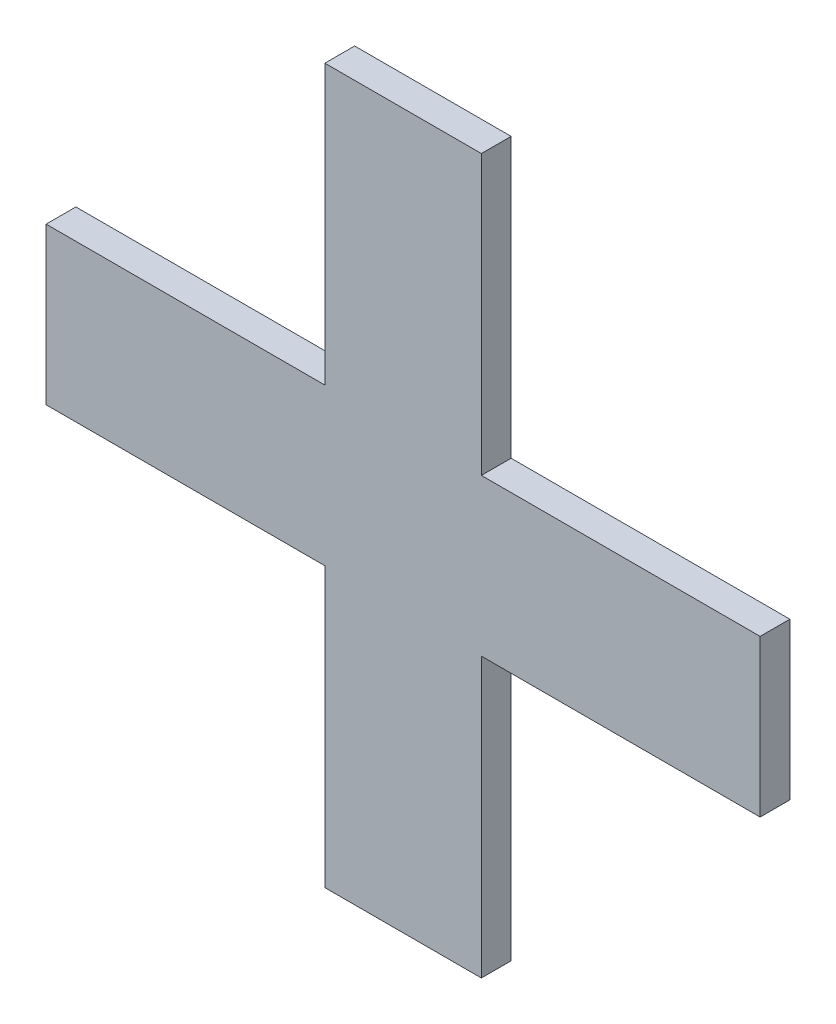
ISO-10303-21;
HEADER;
FILE_DESCRIPTION(('STEP AP214'),'2;1');
FILE_NAME('part.step','',(''),(''),'','','');
FILE_SCHEMA(('AUTOMOTIVE_DESIGN { 1 0 10303 214 1 1 1 1 }'));
ENDSEC;
DATA;
#1=APPLICATION_CONTEXT('core data for automotive mechanical design processes');
#2=APPLICATION_PROTOCOL_DEFINITION('international standard','automotive_design',2000,#1);
#3=PRODUCT_CONTEXT('',#1,'mechanical');
#4=PRODUCT('Part','Part','',(#3));
#5=PRODUCT_RELATED_PRODUCT_CATEGORY('part','',(#4));
#6=PRODUCT_DEFINITION_FORMATION('','',#4);
#7=PRODUCT_DEFINITION_CONTEXT('part definition',#1,'design');
#8=PRODUCT_DEFINITION('design','',#6,#7);
#9=PRODUCT_DEFINITION_SHAPE('','',#8);
#10=(LENGTH_UNIT() NAMED_UNIT(*) SI_UNIT(.MILLI.,.METRE.));
#11=(NAMED_UNIT(*) PLANE_ANGLE_UNIT() SI_UNIT($,.RADIAN.));
#12=(NAMED_UNIT(*) SI_UNIT($,.STERADIAN.) SOLID_ANGLE_UNIT());
#13=UNCERTAINTY_MEASURE_WITH_UNIT(LENGTH_MEASURE(1.E-05),#10,'distance_accuracy_value','');
#14=(GEOMETRIC_REPRESENTATION_CONTEXT(3) GLOBAL_UNCERTAINTY_ASSIGNED_CONTEXT((#13)) GLOBAL_UNIT_ASSIGNED_CONTEXT((#10,
#11,#12)) REPRESENTATION_CONTEXT('',''));
#15=CARTESIAN_POINT('',(0.,0.,0.));
#16=DIRECTION('',(0.,0.,1.));
#17=DIRECTION('',(1.,0.,0.));
#18=AXIS2_PLACEMENT_3D('',#15,#16,#17);
#19=CARTESIAN_POINT('',(0.,-13.15,5.));
#20=DIRECTION('',(0.,1.,0.));
#21=DIRECTION('',(0.,0.,1.));
#22=AXIS2_PLACEMENT_3D('',#19,#20,#21);
#23=PLANE('',#22);
#24=DIRECTION('',(1.,0.,0.));
#25=VECTOR('',#24,1.);
#26=CARTESIAN_POINT('',(0.,-13.15,0.));
#27=LINE('',#26,#25);
#28=CARTESIAN_POINT('',(-60.,-13.15,0.));
#29=VERTEX_POINT('',#28);
#30=CARTESIAN_POINT('',(-13.15,-13.15,0.));
#31=VERTEX_POINT('',#30);
#32=EDGE_CURVE('E166',#29,#31,#27,.T.);
#33=ORIENTED_EDGE('',*,*,#32,.T.);
#34=DIRECTION('',(0.,0.,-1.));
#35=VECTOR('',#34,1.);
#36=CARTESIAN_POINT('',(-13.15,-13.15,5.));
#37=LINE('',#36,#35);
#38=CARTESIAN_POINT('',(-13.15,-13.15,5.));
#39=VERTEX_POINT('',#38);
#40=EDGE_CURVE('E11',#39,#31,#37,.T.);
#41=ORIENTED_EDGE('',*,*,#40,.F.);
#42=DIRECTION('',(1.,0.,0.));
#43=VECTOR('',#42,1.);
#44=CARTESIAN_POINT('',(0.,-13.15,5.));
#45=LINE('',#44,#43);
#46=CARTESIAN_POINT('',(-60.,-13.15,5.));
#47=VERTEX_POINT('',#46);
#48=EDGE_CURVE('E108',#47,#39,#45,.T.);
#49=ORIENTED_EDGE('',*,*,#48,.F.);
#50=DIRECTION('',(0.,0.,-1.));
#51=VECTOR('',#50,1.);
#52=CARTESIAN_POINT('',(-60.,-13.15,5.));
#53=LINE('',#52,#51);
#54=EDGE_CURVE('E162',#47,#29,#53,.T.);
#55=ORIENTED_EDGE('',*,*,#54,.T.);
#56=EDGE_LOOP('',(#33,#41,#49,#55));
#57=FACE_BOUND('',#56,.T.);
#58=ADVANCED_FACE('F43',(#57),#23,.F.);
#59=CARTESIAN_POINT('',(-13.15,0.,5.));
#60=DIRECTION('',(-1.,0.,0.));
#61=DIRECTION('',(0.,0.,1.));
#62=AXIS2_PLACEMENT_3D('',#59,#60,#61);
#63=PLANE('',#62);
#64=DIRECTION('',(0.,1.,0.));
#65=VECTOR('',#64,1.);
#66=CARTESIAN_POINT('',(-13.15,0.,0.));
#67=LINE('',#66,#65);
#68=CARTESIAN_POINT('',(-13.15,-60.,0.));
#69=VERTEX_POINT('',#68);
#70=EDGE_CURVE('E170',#69,#31,#67,.T.);
#71=ORIENTED_EDGE('',*,*,#70,.F.);
#72=DIRECTION('',(0.,0.,-1.));
#73=VECTOR('',#72,1.);
#74=CARTESIAN_POINT('',(-13.15,-60.,5.));
#75=LINE('',#74,#73);
#76=CARTESIAN_POINT('',(-13.15,-60.,5.));
#77=VERTEX_POINT('',#76);
#78=EDGE_CURVE('E52',#77,#69,#75,.T.);
#79=ORIENTED_EDGE('',*,*,#78,.F.);
#80=DIRECTION('',(0.,1.,0.));
#81=VECTOR('',#80,1.);
#82=CARTESIAN_POINT('',(-13.15,0.,5.));
#83=LINE('',#82,#81);
#84=EDGE_CURVE('E238',#77,#39,#83,.T.);
#85=ORIENTED_EDGE('',*,*,#84,.T.);
#86=ORIENTED_EDGE('',*,*,#40,.T.);
#87=EDGE_LOOP('',(#71,#79,#85,#86));
#88=FACE_BOUND('',#87,.T.);
#89=ADVANCED_FACE('F237',(#88),#63,.T.);
#90=CARTESIAN_POINT('',(0.,-60.,5.));
#91=DIRECTION('',(0.,1.,0.));
#92=DIRECTION('',(0.,0.,1.));
#93=AXIS2_PLACEMENT_3D('',#90,#91,#92);
#94=PLANE('',#93);
#95=DIRECTION('',(1.,0.,0.));
#96=VECTOR('',#95,1.);
#97=CARTESIAN_POINT('',(0.,-60.,0.));
#98=LINE('',#97,#96);
#99=CARTESIAN_POINT('',(13.15,-60.,0.));
#100=VERTEX_POINT('',#99);
#101=EDGE_CURVE('E174',#69,#100,#98,.T.);
#102=ORIENTED_EDGE('',*,*,#101,.T.);
#103=DIRECTION('',(0.,0.,-1.));
#104=VECTOR('',#103,1.);
#105=CARTESIAN_POINT('',(13.15,-60.,5.));
#106=LINE('',#105,#104);
#107=CARTESIAN_POINT('',(13.15,-60.,5.));
#108=VERTEX_POINT('',#107);
#109=EDGE_CURVE('E220',#108,#100,#106,.T.);
#110=ORIENTED_EDGE('',*,*,#109,.F.);
#111=DIRECTION('',(1.,0.,0.));
#112=VECTOR('',#111,1.);
#113=CARTESIAN_POINT('',(0.,-60.,5.));
#114=LINE('',#113,#112);
#115=EDGE_CURVE('E228',#77,#108,#114,.T.);
#116=ORIENTED_EDGE('',*,*,#115,.F.);
#117=ORIENTED_EDGE('',*,*,#78,.T.);
#118=EDGE_LOOP('',(#102,#110,#116,#117));
#119=FACE_BOUND('',#118,.T.);
#120=ADVANCED_FACE('F226',(#119),#94,.F.);
#121=CARTESIAN_POINT('',(13.15,0.,5.));
#122=DIRECTION('',(-1.,0.,0.));
#123=DIRECTION('',(0.,0.,1.));
#124=AXIS2_PLACEMENT_3D('',#121,#122,#123);
#125=PLANE('',#124);
#126=DIRECTION('',(0.,1.,0.));
#127=VECTOR('',#126,1.);
#128=CARTESIAN_POINT('',(13.15,0.,0.));
#129=LINE('',#128,#127);
#130=CARTESIAN_POINT('',(13.15,-13.15,0.));
#131=VERTEX_POINT('',#130);
#132=EDGE_CURVE('E177',#100,#131,#129,.T.);
#133=ORIENTED_EDGE('',*,*,#132,.T.);
#134=DIRECTION('',(0.,0.,-1.));
#135=VECTOR('',#134,1.);
#136=CARTESIAN_POINT('',(13.15,-13.15,5.));
#137=LINE('',#136,#135);
#138=CARTESIAN_POINT('',(13.15,-13.15,5.));
#139=VERTEX_POINT('',#138);
#140=EDGE_CURVE('E217',#139,#131,#137,.T.);
#141=ORIENTED_EDGE('',*,*,#140,.F.);
#142=DIRECTION('',(0.,1.,0.));
#143=VECTOR('',#142,1.);
#144=CARTESIAN_POINT('',(13.15,0.,5.));
#145=LINE('',#144,#143);
#146=EDGE_CURVE('E270',#108,#139,#145,.T.);
#147=ORIENTED_EDGE('',*,*,#146,.F.);
#148=ORIENTED_EDGE('',*,*,#109,.T.);
#149=EDGE_LOOP('',(#133,#141,#147,#148));
#150=FACE_BOUND('',#149,.T.);
#151=ADVANCED_FACE('F269',(#150),#125,.F.);
#152=CARTESIAN_POINT('',(0.,-13.15,5.));
#153=DIRECTION('',(0.,1.,0.));
#154=DIRECTION('',(0.,0.,1.));
#155=AXIS2_PLACEMENT_3D('',#152,#153,#154);
#156=PLANE('',#155);
#157=DIRECTION('',(1.,0.,0.));
#158=VECTOR('',#157,1.);
#159=CARTESIAN_POINT('',(0.,-13.15,0.));
#160=LINE('',#159,#158);
#161=CARTESIAN_POINT('',(60.,-13.15,0.));
#162=VERTEX_POINT('',#161);
#163=EDGE_CURVE('E180',#131,#162,#160,.T.);
#164=ORIENTED_EDGE('',*,*,#163,.T.);
#165=DIRECTION('',(0.,0.,-1.));
#166=VECTOR('',#165,1.);
#167=CARTESIAN_POINT('',(60.,-13.15,5.));
#168=LINE('',#167,#166);
#169=CARTESIAN_POINT('',(60.,-13.15,5.));
#170=VERTEX_POINT('',#169);
#171=EDGE_CURVE('E215',#170,#162,#168,.T.);
#172=ORIENTED_EDGE('',*,*,#171,.F.);
#173=DIRECTION('',(1.,0.,0.));
#174=VECTOR('',#173,1.);
#175=CARTESIAN_POINT('',(0.,-13.15,5.));
#176=LINE('',#175,#174);
#177=EDGE_CURVE('E266',#139,#170,#176,.T.);
#178=ORIENTED_EDGE('',*,*,#177,.F.);
#179=ORIENTED_EDGE('',*,*,#140,.T.);
#180=EDGE_LOOP('',(#164,#172,#178,#179));
#181=FACE_BOUND('',#180,.T.);
#182=ADVANCED_FACE('F264',(#181),#156,.F.);
#183=CARTESIAN_POINT('',(60.,0.,5.));
#184=DIRECTION('',(1.,0.,0.));
#185=DIRECTION('',(0.,0.,-1.));
#186=AXIS2_PLACEMENT_3D('',#183,#184,#185);
#187=PLANE('',#186);
#188=DIRECTION('',(0.,-1.,0.));
#189=VECTOR('',#188,1.);
#190=CARTESIAN_POINT('',(60.,0.,0.));
#191=LINE('',#190,#189);
#192=CARTESIAN_POINT('',(60.,13.15,0.));
#193=VERTEX_POINT('',#192);
#194=EDGE_CURVE('E184',#193,#162,#191,.T.);
#195=ORIENTED_EDGE('',*,*,#194,.F.);
#196=DIRECTION('',(0.,0.,-1.));
#197=VECTOR('',#196,1.);
#198=CARTESIAN_POINT('',(60.,13.15,5.));
#199=LINE('',#198,#197);
#200=CARTESIAN_POINT('',(60.,13.15,5.));
#201=VERTEX_POINT('',#200);
#202=EDGE_CURVE('E213',#201,#193,#199,.T.);
#203=ORIENTED_EDGE('',*,*,#202,.F.);
#204=DIRECTION('',(0.,-1.,0.));
#205=VECTOR('',#204,1.);
#206=CARTESIAN_POINT('',(60.,0.,5.));
#207=LINE('',#206,#205);
#208=EDGE_CURVE('E261',#201,#170,#207,.T.);
#209=ORIENTED_EDGE('',*,*,#208,.T.);
#210=ORIENTED_EDGE('',*,*,#171,.T.);
#211=EDGE_LOOP('',(#195,#203,#209,#210));
#212=FACE_BOUND('',#211,.T.);
#213=ADVANCED_FACE('F257',(#212),#187,.T.);
#214=CARTESIAN_POINT('',(0.,13.15,5.));
#215=DIRECTION('',(0.,1.,0.));
#216=DIRECTION('',(0.,0.,1.));
#217=AXIS2_PLACEMENT_3D('',#214,#215,#216);
#218=PLANE('',#217);
#219=DIRECTION('',(1.,0.,0.));
#220=VECTOR('',#219,1.);
#221=CARTESIAN_POINT('',(0.,13.15,0.));
#222=LINE('',#221,#220);
#223=CARTESIAN_POINT('',(13.15,13.15,0.));
#224=VERTEX_POINT('',#223);
#225=EDGE_CURVE('E188',#224,#193,#222,.T.);
#226=ORIENTED_EDGE('',*,*,#225,.F.);
#227=DIRECTION('',(0.,0.,-1.));
#228=VECTOR('',#227,1.);
#229=CARTESIAN_POINT('',(13.15,13.15,5.));
#230=LINE('',#229,#228);
#231=CARTESIAN_POINT('',(13.15,13.15,5.));
#232=VERTEX_POINT('',#231);
#233=EDGE_CURVE('E211',#232,#224,#230,.T.);
#234=ORIENTED_EDGE('',*,*,#233,.F.);
#235=DIRECTION('',(1.,0.,0.));
#236=VECTOR('',#235,1.);
#237=CARTESIAN_POINT('',(0.,13.15,5.));
#238=LINE('',#237,#236);
#239=EDGE_CURVE('E254',#232,#201,#238,.T.);
#240=ORIENTED_EDGE('',*,*,#239,.T.);
#241=ORIENTED_EDGE('',*,*,#202,.T.);
#242=EDGE_LOOP('',(#226,#234,#240,#241));
#243=FACE_BOUND('',#242,.T.);
#244=ADVANCED_FACE('F253',(#243),#218,.T.);
#245=CARTESIAN_POINT('',(13.15,0.,5.));
#246=DIRECTION('',(-1.,0.,0.));
#247=DIRECTION('',(0.,0.,1.));
#248=AXIS2_PLACEMENT_3D('',#245,#246,#247);
#249=PLANE('',#248);
#250=DIRECTION('',(0.,1.,0.));
#251=VECTOR('',#250,1.);
#252=CARTESIAN_POINT('',(13.15,0.,0.));
#253=LINE('',#252,#251);
#254=CARTESIAN_POINT('',(13.15,60.,0.));
#255=VERTEX_POINT('',#254);
#256=EDGE_CURVE('E192',#224,#255,#253,.T.);
#257=ORIENTED_EDGE('',*,*,#256,.T.);
#258=DIRECTION('',(0.,0.,-1.));
#259=VECTOR('',#258,1.);
#260=CARTESIAN_POINT('',(13.15,60.,5.));
#261=LINE('',#260,#259);
#262=CARTESIAN_POINT('',(13.15,60.,5.));
#263=VERTEX_POINT('',#262);
#264=EDGE_CURVE('E209',#263,#255,#261,.T.);
#265=ORIENTED_EDGE('',*,*,#264,.F.);
#266=DIRECTION('',(0.,1.,0.));
#267=VECTOR('',#266,1.);
#268=CARTESIAN_POINT('',(13.15,0.,5.));
#269=LINE('',#268,#267);
#270=EDGE_CURVE('E249',#232,#263,#269,.T.);
#271=ORIENTED_EDGE('',*,*,#270,.F.);
#272=ORIENTED_EDGE('',*,*,#233,.T.);
#273=EDGE_LOOP('',(#257,#265,#271,#272));
#274=FACE_BOUND('',#273,.T.);
#275=ADVANCED_FACE('F248',(#274),#249,.F.);
#276=CARTESIAN_POINT('',(0.,60.,5.));
#277=DIRECTION('',(0.,1.,0.));
#278=DIRECTION('',(0.,0.,1.));
#279=AXIS2_PLACEMENT_3D('',#276,#277,#278);
#280=PLANE('',#279);
#281=DIRECTION('',(1.,0.,0.));
#282=VECTOR('',#281,1.);
#283=CARTESIAN_POINT('',(0.,60.,0.));
#284=LINE('',#283,#282);
#285=CARTESIAN_POINT('',(-13.15,60.,0.));
#286=VERTEX_POINT('',#285);
#287=EDGE_CURVE('E195',#286,#255,#284,.T.);
#288=ORIENTED_EDGE('',*,*,#287,.F.);
#289=DIRECTION('',(0.,0.,-1.));
#290=VECTOR('',#289,1.);
#291=CARTESIAN_POINT('',(-13.15,60.,5.));
#292=LINE('',#291,#290);
#293=CARTESIAN_POINT('',(-13.15,60.,5.));
#294=VERTEX_POINT('',#293);
#295=EDGE_CURVE('E147',#294,#286,#292,.T.);
#296=ORIENTED_EDGE('',*,*,#295,.F.);
#297=DIRECTION('',(1.,0.,0.));
#298=VECTOR('',#297,1.);
#299=CARTESIAN_POINT('',(0.,60.,5.));
#300=LINE('',#299,#298);
#301=EDGE_CURVE('E153',#294,#263,#300,.T.);
#302=ORIENTED_EDGE('',*,*,#301,.T.);
#303=ORIENTED_EDGE('',*,*,#264,.T.);
#304=EDGE_LOOP('',(#288,#296,#302,#303));
#305=FACE_BOUND('',#304,.T.);
#306=ADVANCED_FACE('F244',(#305),#280,.T.);
#307=CARTESIAN_POINT('',(-13.15,0.,5.));
#308=DIRECTION('',(-1.,0.,0.));
#309=DIRECTION('',(0.,0.,1.));
#310=AXIS2_PLACEMENT_3D('',#307,#308,#309);
#311=PLANE('',#310);
#312=DIRECTION('',(0.,1.,0.));
#313=VECTOR('',#312,1.);
#314=CARTESIAN_POINT('',(-13.15,0.,0.));
#315=LINE('',#314,#313);
#316=CARTESIAN_POINT('',(-13.15,13.15,0.));
#317=VERTEX_POINT('',#316);
#318=EDGE_CURVE('E142',#317,#286,#315,.T.);
#319=ORIENTED_EDGE('',*,*,#318,.F.);
#320=DIRECTION('',(0.,0.,-1.));
#321=VECTOR('',#320,1.);
#322=CARTESIAN_POINT('',(-13.15,13.15,5.));
#323=LINE('',#322,#321);
#324=CARTESIAN_POINT('',(-13.15,13.15,5.));
#325=VERTEX_POINT('',#324);
#326=EDGE_CURVE('E137',#325,#317,#323,.T.);
#327=ORIENTED_EDGE('',*,*,#326,.F.);
#328=DIRECTION('',(0.,1.,0.));
#329=VECTOR('',#328,1.);
#330=CARTESIAN_POINT('',(-13.15,0.,5.));
#331=LINE('',#330,#329);
#332=EDGE_CURVE('E140',#325,#294,#331,.T.);
#333=ORIENTED_EDGE('',*,*,#332,.T.);
#334=ORIENTED_EDGE('',*,*,#295,.T.);
#335=EDGE_LOOP('',(#319,#327,#333,#334));
#336=FACE_BOUND('',#335,.T.);
#337=ADVANCED_FACE('F139',(#336),#311,.T.);
#338=CARTESIAN_POINT('',(0.,13.15,5.));
#339=DIRECTION('',(0.,1.,0.));
#340=DIRECTION('',(0.,0.,1.));
#341=AXIS2_PLACEMENT_3D('',#338,#339,#340);
#342=PLANE('',#341);
#343=DIRECTION('',(1.,0.,0.));
#344=VECTOR('',#343,1.);
#345=CARTESIAN_POINT('',(0.,13.15,0.));
#346=LINE('',#345,#344);
#347=CARTESIAN_POINT('',(-60.,13.15,0.));
#348=VERTEX_POINT('',#347);
#349=EDGE_CURVE('E201',#348,#317,#346,.T.);
#350=ORIENTED_EDGE('',*,*,#349,.F.);
#351=DIRECTION('',(0.,0.,-1.));
#352=VECTOR('',#351,1.);
#353=CARTESIAN_POINT('',(-60.,13.15,5.));
#354=LINE('',#353,#352);
#355=CARTESIAN_POINT('',(-60.,13.15,5.));
#356=VERTEX_POINT('',#355);
#357=EDGE_CURVE('E99',#356,#348,#354,.T.);
#358=ORIENTED_EDGE('',*,*,#357,.F.);
#359=DIRECTION('',(1.,0.,0.));
#360=VECTOR('',#359,1.);
#361=CARTESIAN_POINT('',(0.,13.15,5.));
#362=LINE('',#361,#360);
#363=EDGE_CURVE('E151',#356,#325,#362,.T.);
#364=ORIENTED_EDGE('',*,*,#363,.T.);
#365=ORIENTED_EDGE('',*,*,#326,.T.);
#366=EDGE_LOOP('',(#350,#358,#364,#365));
#367=FACE_BOUND('',#366,.T.);
#368=ADVANCED_FACE('F156',(#367),#342,.T.);
#369=CARTESIAN_POINT('',(-60.,0.,5.));
#370=DIRECTION('',(1.,0.,0.));
#371=DIRECTION('',(0.,0.,-1.));
#372=AXIS2_PLACEMENT_3D('',#369,#370,#371);
#373=PLANE('',#372);
#374=DIRECTION('',(0.,-1.,0.));
#375=VECTOR('',#374,1.);
#376=CARTESIAN_POINT('',(-60.,0.,0.));
#377=LINE('',#376,#375);
#378=EDGE_CURVE('E102',#348,#29,#377,.T.);
#379=ORIENTED_EDGE('',*,*,#378,.T.);
#380=ORIENTED_EDGE('',*,*,#54,.F.);
#381=DIRECTION('',(0.,-1.,0.));
#382=VECTOR('',#381,1.);
#383=CARTESIAN_POINT('',(-60.,0.,5.));
#384=LINE('',#383,#382);
#385=EDGE_CURVE('E60',#356,#47,#384,.T.);
#386=ORIENTED_EDGE('',*,*,#385,.F.);
#387=ORIENTED_EDGE('',*,*,#357,.T.);
#388=EDGE_LOOP('',(#379,#380,#386,#387));
#389=FACE_BOUND('',#388,.T.);
#390=ADVANCED_FACE('F300',(#389),#373,.F.);
#391=CARTESIAN_POINT('',(0.,0.,5.));
#392=DIRECTION('',(0.,0.,1.));
#393=DIRECTION('',(1.,0.,0.));
#394=AXIS2_PLACEMENT_3D('',#391,#392,#393);
#395=PLANE('',#394);
#396=ORIENTED_EDGE('',*,*,#48,.T.);
#397=ORIENTED_EDGE('',*,*,#84,.F.);
#398=ORIENTED_EDGE('',*,*,#115,.T.);
#399=ORIENTED_EDGE('',*,*,#146,.T.);
#400=ORIENTED_EDGE('',*,*,#177,.T.);
#401=ORIENTED_EDGE('',*,*,#208,.F.);
#402=ORIENTED_EDGE('',*,*,#239,.F.);
#403=ORIENTED_EDGE('',*,*,#270,.T.);
#404=ORIENTED_EDGE('',*,*,#301,.F.);
#405=ORIENTED_EDGE('',*,*,#332,.F.);
#406=ORIENTED_EDGE('',*,*,#363,.F.);
#407=ORIENTED_EDGE('',*,*,#385,.T.);
#408=EDGE_LOOP('',(#396,#397,#398,#399,#400,#401,#402,#403,#404,#405,#406,#407));
#409=FACE_BOUND('',#408,.T.);
#410=ADVANCED_FACE('F150',(#409),#395,.T.);
#411=CARTESIAN_POINT('',(0.,0.,0.));
#412=DIRECTION('',(0.,0.,1.));
#413=DIRECTION('',(1.,0.,0.));
#414=AXIS2_PLACEMENT_3D('',#411,#412,#413);
#415=PLANE('',#414);
#416=ORIENTED_EDGE('',*,*,#32,.F.);
#417=ORIENTED_EDGE('',*,*,#378,.F.);
#418=ORIENTED_EDGE('',*,*,#349,.T.);
#419=ORIENTED_EDGE('',*,*,#318,.T.);
#420=ORIENTED_EDGE('',*,*,#287,.T.);
#421=ORIENTED_EDGE('',*,*,#256,.F.);
#422=ORIENTED_EDGE('',*,*,#225,.T.);
#423=ORIENTED_EDGE('',*,*,#194,.T.);
#424=ORIENTED_EDGE('',*,*,#163,.F.);
#425=ORIENTED_EDGE('',*,*,#132,.F.);
#426=ORIENTED_EDGE('',*,*,#101,.F.);
#427=ORIENTED_EDGE('',*,*,#70,.T.);
#428=EDGE_LOOP('',(#416,#417,#418,#419,#420,#421,#422,#423,#424,#425,#426,#427));
#429=FACE_BOUND('',#428,.T.);
#430=ADVANCED_FACE('F235',(#429),#415,.F.);
#431=CLOSED_SHELL('',(#58,#89,#120,#151,#182,#213,#244,#275,#306,#337,#368,#390,#410,#430));
#432=MANIFOLD_SOLID_BREP('B2',#431);
#433=ADVANCED_BREP_SHAPE_REPRESENTATION('',(#18,#432),#14);
#434=SHAPE_DEFINITION_REPRESENTATION(#9,#433);
ENDSEC;
END-ISO-10303-21;
